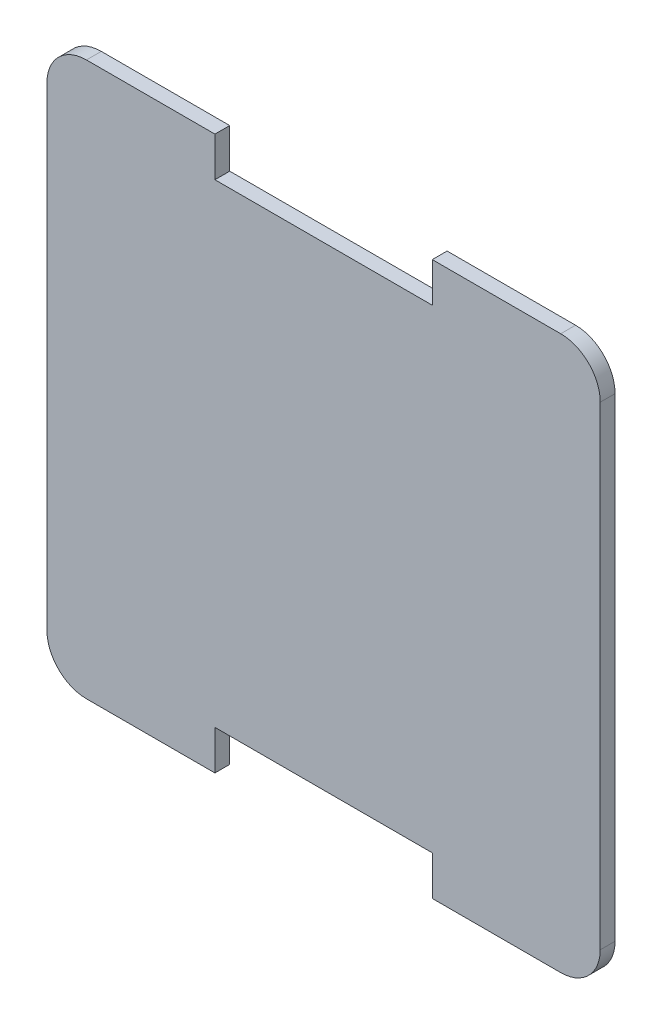
ISO-10303-21;
HEADER;
FILE_DESCRIPTION(('STEP AP214'),'2;1');
FILE_NAME('part.step','',(''),(''),'','','');
FILE_SCHEMA(('AUTOMOTIVE_DESIGN { 1 0 10303 214 1 1 1 1 }'));
ENDSEC;
DATA;
#1=APPLICATION_CONTEXT('core data for automotive mechanical design processes');
#2=APPLICATION_PROTOCOL_DEFINITION('international standard','automotive_design',2000,#1);
#3=PRODUCT_CONTEXT('',#1,'mechanical');
#4=PRODUCT('Part','Part','',(#3));
#5=PRODUCT_RELATED_PRODUCT_CATEGORY('part','',(#4));
#6=PRODUCT_DEFINITION_FORMATION('','',#4);
#7=PRODUCT_DEFINITION_CONTEXT('part definition',#1,'design');
#8=PRODUCT_DEFINITION('design','',#6,#7);
#9=PRODUCT_DEFINITION_SHAPE('','',#8);
#10=(LENGTH_UNIT() NAMED_UNIT(*) SI_UNIT(.MILLI.,.METRE.));
#11=(NAMED_UNIT(*) PLANE_ANGLE_UNIT() SI_UNIT($,.RADIAN.));
#12=(NAMED_UNIT(*) SI_UNIT($,.STERADIAN.) SOLID_ANGLE_UNIT());
#13=UNCERTAINTY_MEASURE_WITH_UNIT(LENGTH_MEASURE(1.E-05),#10,'distance_accuracy_value','');
#14=(GEOMETRIC_REPRESENTATION_CONTEXT(3) GLOBAL_UNCERTAINTY_ASSIGNED_CONTEXT((#13)) GLOBAL_UNIT_ASSIGNED_CONTEXT((#10,
#11,#12)) REPRESENTATION_CONTEXT('',''));
#15=CARTESIAN_POINT('',(0.,0.,0.));
#16=DIRECTION('',(0.,0.,1.));
#17=DIRECTION('',(1.,0.,0.));
#18=AXIS2_PLACEMENT_3D('',#15,#16,#17);
#19=CARTESIAN_POINT('',(25.4000000000002,0.,9.525));
#20=DIRECTION('',(0.,1.,0.));
#21=DIRECTION('',(0.,0.,1.));
#22=AXIS2_PLACEMENT_3D('',#19,#20,#21);
#23=PLANE('',#22);
#24=DIRECTION('',(1.,0.,0.));
#25=VECTOR('',#24,1.);
#26=CARTESIAN_POINT('',(25.4000000000002,0.,9.525));
#27=LINE('',#26,#25);
#28=CARTESIAN_POINT('',(247.65,0.,9.525));
#29=VERTEX_POINT('',#28);
#30=CARTESIAN_POINT('',(330.2,0.,9.525));
#31=VERTEX_POINT('',#30);
#32=EDGE_CURVE('E161',#29,#31,#27,.T.);
#33=ORIENTED_EDGE('',*,*,#32,.F.);
#34=DIRECTION('',(0.,0.,-1.));
#35=VECTOR('',#34,1.);
#36=CARTESIAN_POINT('',(247.65,0.,9.525));
#37=LINE('',#36,#35);
#38=CARTESIAN_POINT('',(247.65,0.,0.));
#39=VERTEX_POINT('',#38);
#40=EDGE_CURVE('E147',#29,#39,#37,.T.);
#41=ORIENTED_EDGE('',*,*,#40,.T.);
#42=DIRECTION('',(1.,0.,0.));
#43=VECTOR('',#42,1.);
#44=CARTESIAN_POINT('',(25.4000000000002,0.,0.));
#45=LINE('',#44,#43);
#46=CARTESIAN_POINT('',(330.2,0.,0.));
#47=VERTEX_POINT('',#46);
#48=EDGE_CURVE('E197',#39,#47,#45,.T.);
#49=ORIENTED_EDGE('',*,*,#48,.T.);
#50=DIRECTION('',(0.,0.,-1.));
#51=VECTOR('',#50,1.);
#52=CARTESIAN_POINT('',(330.2,0.,9.525));
#53=LINE('',#52,#51);
#54=EDGE_CURVE('E41',#31,#47,#53,.T.);
#55=ORIENTED_EDGE('',*,*,#54,.F.);
#56=EDGE_LOOP('',(#33,#41,#49,#55));
#57=FACE_BOUND('',#56,.T.);
#58=ADVANCED_FACE('F33',(#57),#23,.F.);
#59=CARTESIAN_POINT('',(25.4000000000002,355.6,9.525));
#60=DIRECTION('',(0.,-1.,0.));
#61=DIRECTION('',(0.,0.,-1.));
#62=AXIS2_PLACEMENT_3D('',#59,#60,#61);
#63=PLANE('',#62);
#64=DIRECTION('',(-1.,0.,0.));
#65=VECTOR('',#64,1.);
#66=CARTESIAN_POINT('',(25.4000000000002,355.6,0.));
#67=LINE('',#66,#65);
#68=CARTESIAN_POINT('',(330.2,355.6,0.));
#69=VERTEX_POINT('',#68);
#70=CARTESIAN_POINT('',(247.65,355.6,0.));
#71=VERTEX_POINT('',#70);
#72=EDGE_CURVE('E209',#69,#71,#67,.T.);
#73=ORIENTED_EDGE('',*,*,#72,.T.);
#74=DIRECTION('',(0.,0.,-1.));
#75=VECTOR('',#74,1.);
#76=CARTESIAN_POINT('',(247.65,355.6,9.525));
#77=LINE('',#76,#75);
#78=CARTESIAN_POINT('',(247.65,355.6,9.525));
#79=VERTEX_POINT('',#78);
#80=EDGE_CURVE('E198',#79,#71,#77,.T.);
#81=ORIENTED_EDGE('',*,*,#80,.F.);
#82=DIRECTION('',(-1.,0.,0.));
#83=VECTOR('',#82,1.);
#84=CARTESIAN_POINT('',(25.4000000000002,355.6,9.525));
#85=LINE('',#84,#83);
#86=CARTESIAN_POINT('',(330.2,355.6,9.525));
#87=VERTEX_POINT('',#86);
#88=EDGE_CURVE('E186',#87,#79,#85,.T.);
#89=ORIENTED_EDGE('',*,*,#88,.F.);
#90=DIRECTION('',(0.,0.,-1.));
#91=VECTOR('',#90,1.);
#92=CARTESIAN_POINT('',(330.2,355.6,9.525));
#93=LINE('',#92,#91);
#94=EDGE_CURVE('E223',#87,#69,#93,.T.);
#95=ORIENTED_EDGE('',*,*,#94,.T.);
#96=EDGE_LOOP('',(#73,#81,#89,#95));
#97=FACE_BOUND('',#96,.T.);
#98=ADVANCED_FACE('F254',(#97),#63,.F.);
#99=CARTESIAN_POINT('',(25.4,25.4,9.525));
#100=DIRECTION('',(0.,0.,-1.));
#101=DIRECTION('',(-1.,0.,0.));
#102=AXIS2_PLACEMENT_3D('',#99,#100,#101);
#103=CYLINDRICAL_SURFACE('',#102,25.4);
#104=CARTESIAN_POINT('',(25.4,25.4,0.));
#105=DIRECTION('',(0.,0.,1.));
#106=DIRECTION('',(-1.,0.,0.));
#107=AXIS2_PLACEMENT_3D('',#104,#105,#106);
#108=CIRCLE('',#107,25.4);
#109=CARTESIAN_POINT('',(0.,25.4000000000002,0.));
#110=VERTEX_POINT('',#109);
#111=CARTESIAN_POINT('',(25.4000000000002,0.,0.));
#112=VERTEX_POINT('',#111);
#113=EDGE_CURVE('E194',#110,#112,#108,.T.);
#114=ORIENTED_EDGE('',*,*,#113,.T.);
#115=DIRECTION('',(0.,0.,-1.));
#116=VECTOR('',#115,1.);
#117=CARTESIAN_POINT('',(25.4000000000002,0.,9.525));
#118=LINE('',#117,#116);
#119=CARTESIAN_POINT('',(25.4000000000002,0.,9.525));
#120=VERTEX_POINT('',#119);
#121=EDGE_CURVE('E11',#120,#112,#118,.T.);
#122=ORIENTED_EDGE('',*,*,#121,.F.);
#123=CARTESIAN_POINT('',(25.4,25.4,9.525));
#124=DIRECTION('',(0.,0.,1.));
#125=DIRECTION('',(-1.,0.,0.));
#126=AXIS2_PLACEMENT_3D('',#123,#124,#125);
#127=CIRCLE('',#126,25.4);
#128=CARTESIAN_POINT('',(0.,25.4000000000002,9.525));
#129=VERTEX_POINT('',#128);
#130=EDGE_CURVE('E171',#129,#120,#127,.T.);
#131=ORIENTED_EDGE('',*,*,#130,.F.);
#132=DIRECTION('',(0.,0.,-1.));
#133=VECTOR('',#132,1.);
#134=CARTESIAN_POINT('',(0.,25.4000000000002,9.525));
#135=LINE('',#134,#133);
#136=EDGE_CURVE('E193',#129,#110,#135,.T.);
#137=ORIENTED_EDGE('',*,*,#136,.T.);
#138=EDGE_LOOP('',(#114,#122,#131,#137));
#139=FACE_BOUND('',#138,.T.);
#140=ADVANCED_FACE('F35',(#139),#103,.T.);
#141=CARTESIAN_POINT('',(107.95,0.,0.));
#142=VERTEX_POINT('',#141);
#143=EDGE_CURVE('E199',#112,#142,#45,.T.);
#144=ORIENTED_EDGE('',*,*,#143,.T.);
#145=DIRECTION('',(0.,0.,-1.));
#146=VECTOR('',#145,1.);
#147=CARTESIAN_POINT('',(107.95,0.,9.525));
#148=LINE('',#147,#146);
#149=CARTESIAN_POINT('',(107.95,0.,9.525));
#150=VERTEX_POINT('',#149);
#151=EDGE_CURVE('E48',#150,#142,#148,.T.);
#152=ORIENTED_EDGE('',*,*,#151,.F.);
#153=EDGE_CURVE('E170',#120,#150,#27,.T.);
#154=ORIENTED_EDGE('',*,*,#153,.F.);
#155=ORIENTED_EDGE('',*,*,#121,.T.);
#156=EDGE_LOOP('',(#144,#152,#154,#155));
#157=FACE_BOUND('',#156,.T.);
#158=ADVANCED_FACE('F295',(#157),#23,.F.);
#159=CARTESIAN_POINT('',(330.2,25.4,9.525));
#160=DIRECTION('',(0.,0.,-1.));
#161=DIRECTION('',(-1.,0.,0.));
#162=AXIS2_PLACEMENT_3D('',#159,#160,#161);
#163=CYLINDRICAL_SURFACE('',#162,25.4);
#164=CARTESIAN_POINT('',(330.2,25.4,0.));
#165=DIRECTION('',(0.,0.,1.));
#166=DIRECTION('',(1.,0.,0.));
#167=AXIS2_PLACEMENT_3D('',#164,#165,#166);
#168=CIRCLE('',#167,25.4);
#169=CARTESIAN_POINT('',(355.6,25.4000000000002,0.));
#170=VERTEX_POINT('',#169);
#171=EDGE_CURVE('E202',#47,#170,#168,.T.);
#172=ORIENTED_EDGE('',*,*,#171,.T.);
#173=DIRECTION('',(0.,0.,-1.));
#174=VECTOR('',#173,1.);
#175=CARTESIAN_POINT('',(355.6,25.4000000000002,9.525));
#176=LINE('',#175,#174);
#177=CARTESIAN_POINT('',(355.6,25.4000000000002,9.525));
#178=VERTEX_POINT('',#177);
#179=EDGE_CURVE('E229',#178,#170,#176,.T.);
#180=ORIENTED_EDGE('',*,*,#179,.F.);
#181=CARTESIAN_POINT('',(330.2,25.4,9.525));
#182=DIRECTION('',(0.,0.,1.));
#183=DIRECTION('',(1.,0.,0.));
#184=AXIS2_PLACEMENT_3D('',#181,#182,#183);
#185=CIRCLE('',#184,25.4);
#186=EDGE_CURVE('E174',#31,#178,#185,.T.);
#187=ORIENTED_EDGE('',*,*,#186,.F.);
#188=ORIENTED_EDGE('',*,*,#54,.T.);
#189=EDGE_LOOP('',(#172,#180,#187,#188));
#190=FACE_BOUND('',#189,.T.);
#191=ADVANCED_FACE('F233',(#190),#163,.T.);
#192=CARTESIAN_POINT('',(355.6,25.4000000000002,9.525));
#193=DIRECTION('',(-1.,0.,0.));
#194=DIRECTION('',(0.,0.,1.));
#195=AXIS2_PLACEMENT_3D('',#192,#193,#194);
#196=PLANE('',#195);
#197=DIRECTION('',(0.,1.,0.));
#198=VECTOR('',#197,1.);
#199=CARTESIAN_POINT('',(355.6,25.4000000000002,0.));
#200=LINE('',#199,#198);
#201=CARTESIAN_POINT('',(355.6,330.2,0.));
#202=VERTEX_POINT('',#201);
#203=EDGE_CURVE('E204',#170,#202,#200,.T.);
#204=ORIENTED_EDGE('',*,*,#203,.T.);
#205=DIRECTION('',(0.,0.,-1.));
#206=VECTOR('',#205,1.);
#207=CARTESIAN_POINT('',(355.6,330.2,9.525));
#208=LINE('',#207,#206);
#209=CARTESIAN_POINT('',(355.6,330.2,9.525));
#210=VERTEX_POINT('',#209);
#211=EDGE_CURVE('E226',#210,#202,#208,.T.);
#212=ORIENTED_EDGE('',*,*,#211,.F.);
#213=DIRECTION('',(0.,1.,0.));
#214=VECTOR('',#213,1.);
#215=CARTESIAN_POINT('',(355.6,25.4000000000002,9.525));
#216=LINE('',#215,#214);
#217=EDGE_CURVE('E181',#178,#210,#216,.T.);
#218=ORIENTED_EDGE('',*,*,#217,.F.);
#219=ORIENTED_EDGE('',*,*,#179,.T.);
#220=EDGE_LOOP('',(#204,#212,#218,#219));
#221=FACE_BOUND('',#220,.T.);
#222=ADVANCED_FACE('F242',(#221),#196,.F.);
#223=CARTESIAN_POINT('',(330.2,330.2,9.525));
#224=DIRECTION('',(0.,0.,-1.));
#225=DIRECTION('',(-1.,0.,0.));
#226=AXIS2_PLACEMENT_3D('',#223,#224,#225);
#227=CYLINDRICAL_SURFACE('',#226,25.4);
#228=CARTESIAN_POINT('',(330.2,330.2,0.));
#229=DIRECTION('',(0.,0.,1.));
#230=DIRECTION('',(-1.,0.,0.));
#231=AXIS2_PLACEMENT_3D('',#228,#229,#230);
#232=CIRCLE('',#231,25.4);
#233=EDGE_CURVE('E206',#202,#69,#232,.T.);
#234=ORIENTED_EDGE('',*,*,#233,.T.);
#235=ORIENTED_EDGE('',*,*,#94,.F.);
#236=CARTESIAN_POINT('',(330.2,330.2,9.525));
#237=DIRECTION('',(0.,0.,1.));
#238=DIRECTION('',(-1.,0.,0.));
#239=AXIS2_PLACEMENT_3D('',#236,#237,#238);
#240=CIRCLE('',#239,25.4);
#241=EDGE_CURVE('E183',#210,#87,#240,.T.);
#242=ORIENTED_EDGE('',*,*,#241,.F.);
#243=ORIENTED_EDGE('',*,*,#211,.T.);
#244=EDGE_LOOP('',(#234,#235,#242,#243));
#245=FACE_BOUND('',#244,.T.);
#246=ADVANCED_FACE('F246',(#245),#227,.T.);
#247=CARTESIAN_POINT('',(107.95,355.6,9.525));
#248=VERTEX_POINT('',#247);
#249=CARTESIAN_POINT('',(25.4000000000002,355.6,9.525));
#250=VERTEX_POINT('',#249);
#251=EDGE_CURVE('E185',#248,#250,#85,.T.);
#252=ORIENTED_EDGE('',*,*,#251,.F.);
#253=DIRECTION('',(0.,0.,-1.));
#254=VECTOR('',#253,1.);
#255=CARTESIAN_POINT('',(107.95,355.6,9.525));
#256=LINE('',#255,#254);
#257=CARTESIAN_POINT('',(107.95,355.6,0.));
#258=VERTEX_POINT('',#257);
#259=EDGE_CURVE('E255',#248,#258,#256,.T.);
#260=ORIENTED_EDGE('',*,*,#259,.T.);
#261=CARTESIAN_POINT('',(25.4000000000002,355.6,0.));
#262=VERTEX_POINT('',#261);
#263=EDGE_CURVE('E208',#258,#262,#67,.T.);
#264=ORIENTED_EDGE('',*,*,#263,.T.);
#265=DIRECTION('',(0.,0.,-1.));
#266=VECTOR('',#265,1.);
#267=CARTESIAN_POINT('',(25.4000000000002,355.6,9.525));
#268=LINE('',#267,#266);
#269=EDGE_CURVE('E220',#250,#262,#268,.T.);
#270=ORIENTED_EDGE('',*,*,#269,.F.);
#271=EDGE_LOOP('',(#252,#260,#264,#270));
#272=FACE_BOUND('',#271,.T.);
#273=ADVANCED_FACE('F317',(#272),#63,.F.);
#274=CARTESIAN_POINT('',(25.4,330.2,9.525));
#275=DIRECTION('',(0.,0.,-1.));
#276=DIRECTION('',(-1.,0.,0.));
#277=AXIS2_PLACEMENT_3D('',#274,#275,#276);
#278=CYLINDRICAL_SURFACE('',#277,25.4);
#279=CARTESIAN_POINT('',(25.4,330.2,0.));
#280=DIRECTION('',(0.,0.,1.));
#281=DIRECTION('',(-1.,0.,0.));
#282=AXIS2_PLACEMENT_3D('',#279,#280,#281);
#283=CIRCLE('',#282,25.4);
#284=CARTESIAN_POINT('',(0.,330.2,0.));
#285=VERTEX_POINT('',#284);
#286=EDGE_CURVE('E212',#262,#285,#283,.T.);
#287=ORIENTED_EDGE('',*,*,#286,.T.);
#288=DIRECTION('',(0.,0.,-1.));
#289=VECTOR('',#288,1.);
#290=CARTESIAN_POINT('',(0.,330.2,9.525));
#291=LINE('',#290,#289);
#292=CARTESIAN_POINT('',(0.,330.2,9.525));
#293=VERTEX_POINT('',#292);
#294=EDGE_CURVE('E217',#293,#285,#291,.T.);
#295=ORIENTED_EDGE('',*,*,#294,.F.);
#296=CARTESIAN_POINT('',(25.4,330.2,9.525));
#297=DIRECTION('',(0.,0.,1.));
#298=DIRECTION('',(-1.,0.,0.));
#299=AXIS2_PLACEMENT_3D('',#296,#297,#298);
#300=CIRCLE('',#299,25.4);
#301=EDGE_CURVE('E189',#250,#293,#300,.T.);
#302=ORIENTED_EDGE('',*,*,#301,.F.);
#303=ORIENTED_EDGE('',*,*,#269,.T.);
#304=EDGE_LOOP('',(#287,#295,#302,#303));
#305=FACE_BOUND('',#304,.T.);
#306=ADVANCED_FACE('F337',(#305),#278,.T.);
#307=CARTESIAN_POINT('',(0.,25.4000000000002,9.525));
#308=DIRECTION('',(1.,0.,0.));
#309=DIRECTION('',(0.,0.,-1.));
#310=AXIS2_PLACEMENT_3D('',#307,#308,#309);
#311=PLANE('',#310);
#312=DIRECTION('',(0.,-1.,0.));
#313=VECTOR('',#312,1.);
#314=CARTESIAN_POINT('',(0.,25.4000000000002,0.));
#315=LINE('',#314,#313);
#316=EDGE_CURVE('E176',#285,#110,#315,.T.);
#317=ORIENTED_EDGE('',*,*,#316,.T.);
#318=ORIENTED_EDGE('',*,*,#136,.F.);
#319=DIRECTION('',(0.,-1.,0.));
#320=VECTOR('',#319,1.);
#321=CARTESIAN_POINT('',(0.,25.4000000000002,9.525));
#322=LINE('',#321,#320);
#323=EDGE_CURVE('E191',#293,#129,#322,.T.);
#324=ORIENTED_EDGE('',*,*,#323,.F.);
#325=ORIENTED_EDGE('',*,*,#294,.T.);
#326=EDGE_LOOP('',(#317,#318,#324,#325));
#327=FACE_BOUND('',#326,.T.);
#328=ADVANCED_FACE('F332',(#327),#311,.F.);
#329=CARTESIAN_POINT('',(25.4,25.4,9.525));
#330=DIRECTION('',(0.,0.,-1.));
#331=DIRECTION('',(-1.,0.,0.));
#332=AXIS2_PLACEMENT_3D('',#329,#330,#331);
#333=PLANE('',#332);
#334=DIRECTION('',(1.,0.,0.));
#335=VECTOR('',#334,1.);
#336=CARTESIAN_POINT('',(247.65,25.4,9.525));
#337=LINE('',#336,#335);
#338=CARTESIAN_POINT('',(107.95,25.4,9.525));
#339=VERTEX_POINT('',#338);
#340=CARTESIAN_POINT('',(247.65,25.4,9.525));
#341=VERTEX_POINT('',#340);
#342=EDGE_CURVE('E157',#339,#341,#337,.T.);
#343=ORIENTED_EDGE('',*,*,#342,.T.);
#344=DIRECTION('',(0.,-1.,0.));
#345=VECTOR('',#344,1.);
#346=CARTESIAN_POINT('',(247.65,25.4,9.525));
#347=LINE('',#346,#345);
#348=EDGE_CURVE('E150',#341,#29,#347,.T.);
#349=ORIENTED_EDGE('',*,*,#348,.T.);
#350=ORIENTED_EDGE('',*,*,#32,.T.);
#351=ORIENTED_EDGE('',*,*,#186,.T.);
#352=ORIENTED_EDGE('',*,*,#217,.T.);
#353=ORIENTED_EDGE('',*,*,#241,.T.);
#354=ORIENTED_EDGE('',*,*,#88,.T.);
#355=DIRECTION('',(0.,-1.,0.));
#356=VECTOR('',#355,1.);
#357=CARTESIAN_POINT('',(247.65,355.6,9.525));
#358=LINE('',#357,#356);
#359=CARTESIAN_POINT('',(247.65,330.2,9.525));
#360=VERTEX_POINT('',#359);
#361=EDGE_CURVE('E251',#79,#360,#358,.T.);
#362=ORIENTED_EDGE('',*,*,#361,.T.);
#363=DIRECTION('',(-1.,0.,0.));
#364=VECTOR('',#363,1.);
#365=CARTESIAN_POINT('',(247.65,330.2,9.525));
#366=LINE('',#365,#364);
#367=CARTESIAN_POINT('',(107.95,330.2,9.525));
#368=VERTEX_POINT('',#367);
#369=EDGE_CURVE('E271',#360,#368,#366,.T.);
#370=ORIENTED_EDGE('',*,*,#369,.T.);
#371=DIRECTION('',(0.,1.,0.));
#372=VECTOR('',#371,1.);
#373=CARTESIAN_POINT('',(107.95,355.6,9.525));
#374=LINE('',#373,#372);
#375=EDGE_CURVE('E265',#368,#248,#374,.T.);
#376=ORIENTED_EDGE('',*,*,#375,.T.);
#377=ORIENTED_EDGE('',*,*,#251,.T.);
#378=ORIENTED_EDGE('',*,*,#301,.T.);
#379=ORIENTED_EDGE('',*,*,#323,.T.);
#380=ORIENTED_EDGE('',*,*,#130,.T.);
#381=ORIENTED_EDGE('',*,*,#153,.T.);
#382=DIRECTION('',(0.,1.,0.));
#383=VECTOR('',#382,1.);
#384=CARTESIAN_POINT('',(107.95,25.4,9.525));
#385=LINE('',#384,#383);
#386=EDGE_CURVE('E165',#150,#339,#385,.T.);
#387=ORIENTED_EDGE('',*,*,#386,.T.);
#388=EDGE_LOOP('',(#343,#349,#350,#351,#352,#353,#354,#362,#370,#376,#377,#378,#379,#380,#381,#387));
#389=FACE_BOUND('',#388,.T.);
#390=ADVANCED_FACE('F160',(#389),#333,.F.);
#391=CARTESIAN_POINT('',(25.4,25.4,0.));
#392=DIRECTION('',(0.,0.,-1.));
#393=DIRECTION('',(-1.,0.,0.));
#394=AXIS2_PLACEMENT_3D('',#391,#392,#393);
#395=PLANE('',#394);
#396=DIRECTION('',(0.,-1.,0.));
#397=VECTOR('',#396,1.);
#398=CARTESIAN_POINT('',(247.65,25.4,0.));
#399=LINE('',#398,#397);
#400=CARTESIAN_POINT('',(247.65,25.4,0.));
#401=VERTEX_POINT('',#400);
#402=EDGE_CURVE('E153',#401,#39,#399,.T.);
#403=ORIENTED_EDGE('',*,*,#402,.F.);
#404=DIRECTION('',(1.,0.,0.));
#405=VECTOR('',#404,1.);
#406=CARTESIAN_POINT('',(247.65,25.4,0.));
#407=LINE('',#406,#405);
#408=CARTESIAN_POINT('',(107.95,25.4,0.));
#409=VERTEX_POINT('',#408);
#410=EDGE_CURVE('E166',#409,#401,#407,.T.);
#411=ORIENTED_EDGE('',*,*,#410,.F.);
#412=DIRECTION('',(0.,1.,0.));
#413=VECTOR('',#412,1.);
#414=CARTESIAN_POINT('',(107.95,25.4,0.));
#415=LINE('',#414,#413);
#416=EDGE_CURVE('E289',#142,#409,#415,.T.);
#417=ORIENTED_EDGE('',*,*,#416,.F.);
#418=ORIENTED_EDGE('',*,*,#143,.F.);
#419=ORIENTED_EDGE('',*,*,#113,.F.);
#420=ORIENTED_EDGE('',*,*,#316,.F.);
#421=ORIENTED_EDGE('',*,*,#286,.F.);
#422=ORIENTED_EDGE('',*,*,#263,.F.);
#423=DIRECTION('',(0.,1.,0.));
#424=VECTOR('',#423,1.);
#425=CARTESIAN_POINT('',(107.95,355.6,0.));
#426=LINE('',#425,#424);
#427=CARTESIAN_POINT('',(107.95,330.2,0.));
#428=VERTEX_POINT('',#427);
#429=EDGE_CURVE('E261',#428,#258,#426,.T.);
#430=ORIENTED_EDGE('',*,*,#429,.F.);
#431=DIRECTION('',(-1.,0.,0.));
#432=VECTOR('',#431,1.);
#433=CARTESIAN_POINT('',(247.65,330.2,0.));
#434=LINE('',#433,#432);
#435=CARTESIAN_POINT('',(247.65,330.2,0.));
#436=VERTEX_POINT('',#435);
#437=EDGE_CURVE('E278',#436,#428,#434,.T.);
#438=ORIENTED_EDGE('',*,*,#437,.F.);
#439=DIRECTION('',(0.,-1.,0.));
#440=VECTOR('',#439,1.);
#441=CARTESIAN_POINT('',(247.65,355.6,0.));
#442=LINE('',#441,#440);
#443=EDGE_CURVE('E56',#71,#436,#442,.T.);
#444=ORIENTED_EDGE('',*,*,#443,.F.);
#445=ORIENTED_EDGE('',*,*,#72,.F.);
#446=ORIENTED_EDGE('',*,*,#233,.F.);
#447=ORIENTED_EDGE('',*,*,#203,.F.);
#448=ORIENTED_EDGE('',*,*,#171,.F.);
#449=ORIENTED_EDGE('',*,*,#48,.F.);
#450=EDGE_LOOP('',(#403,#411,#417,#418,#419,#420,#421,#422,#430,#438,#444,#445,#446,#447,#448,#449));
#451=FACE_BOUND('',#450,.T.);
#452=ADVANCED_FACE('F237',(#451),#395,.T.);
#453=CARTESIAN_POINT('',(247.65,355.6,9.525));
#454=DIRECTION('',(1.,0.,0.));
#455=DIRECTION('',(0.,0.,-1.));
#456=AXIS2_PLACEMENT_3D('',#453,#454,#455);
#457=PLANE('',#456);
#458=ORIENTED_EDGE('',*,*,#443,.T.);
#459=DIRECTION('',(0.,0.,-1.));
#460=VECTOR('',#459,1.);
#461=CARTESIAN_POINT('',(247.65,330.2,9.525));
#462=LINE('',#461,#460);
#463=EDGE_CURVE('E264',#360,#436,#462,.T.);
#464=ORIENTED_EDGE('',*,*,#463,.F.);
#465=ORIENTED_EDGE('',*,*,#361,.F.);
#466=ORIENTED_EDGE('',*,*,#80,.T.);
#467=EDGE_LOOP('',(#458,#464,#465,#466));
#468=FACE_BOUND('',#467,.T.);
#469=ADVANCED_FACE('F347',(#468),#457,.F.);
#470=CARTESIAN_POINT('',(107.95,355.6,9.525));
#471=DIRECTION('',(-1.,0.,0.));
#472=DIRECTION('',(0.,0.,1.));
#473=AXIS2_PLACEMENT_3D('',#470,#471,#472);
#474=PLANE('',#473);
#475=ORIENTED_EDGE('',*,*,#429,.T.);
#476=ORIENTED_EDGE('',*,*,#259,.F.);
#477=ORIENTED_EDGE('',*,*,#375,.F.);
#478=DIRECTION('',(0.,0.,-1.));
#479=VECTOR('',#478,1.);
#480=CARTESIAN_POINT('',(107.95,330.2,9.525));
#481=LINE('',#480,#479);
#482=EDGE_CURVE('E258',#368,#428,#481,.T.);
#483=ORIENTED_EDGE('',*,*,#482,.T.);
#484=EDGE_LOOP('',(#475,#476,#477,#483));
#485=FACE_BOUND('',#484,.T.);
#486=ADVANCED_FACE('F341',(#485),#474,.F.);
#487=CARTESIAN_POINT('',(247.65,330.2,9.525));
#488=DIRECTION('',(0.,-1.,0.));
#489=DIRECTION('',(0.,0.,-1.));
#490=AXIS2_PLACEMENT_3D('',#487,#488,#489);
#491=PLANE('',#490);
#492=ORIENTED_EDGE('',*,*,#437,.T.);
#493=ORIENTED_EDGE('',*,*,#482,.F.);
#494=ORIENTED_EDGE('',*,*,#369,.F.);
#495=ORIENTED_EDGE('',*,*,#463,.T.);
#496=EDGE_LOOP('',(#492,#493,#494,#495));
#497=FACE_BOUND('',#496,.T.);
#498=ADVANCED_FACE('F309',(#497),#491,.F.);
#499=CARTESIAN_POINT('',(247.65,25.4,9.525));
#500=DIRECTION('',(1.,0.,0.));
#501=DIRECTION('',(0.,0.,-1.));
#502=AXIS2_PLACEMENT_3D('',#499,#500,#501);
#503=PLANE('',#502);
#504=ORIENTED_EDGE('',*,*,#402,.T.);
#505=ORIENTED_EDGE('',*,*,#40,.F.);
#506=ORIENTED_EDGE('',*,*,#348,.F.);
#507=DIRECTION('',(0.,0.,-1.));
#508=VECTOR('',#507,1.);
#509=CARTESIAN_POINT('',(247.65,25.4,9.525));
#510=LINE('',#509,#508);
#511=EDGE_CURVE('E279',#341,#401,#510,.T.);
#512=ORIENTED_EDGE('',*,*,#511,.T.);
#513=EDGE_LOOP('',(#504,#505,#506,#512));
#514=FACE_BOUND('',#513,.T.);
#515=ADVANCED_FACE('F149',(#514),#503,.F.);
#516=CARTESIAN_POINT('',(247.65,25.4,9.525));
#517=DIRECTION('',(0.,1.,0.));
#518=DIRECTION('',(0.,0.,1.));
#519=AXIS2_PLACEMENT_3D('',#516,#517,#518);
#520=PLANE('',#519);
#521=ORIENTED_EDGE('',*,*,#410,.T.);
#522=ORIENTED_EDGE('',*,*,#511,.F.);
#523=ORIENTED_EDGE('',*,*,#342,.F.);
#524=DIRECTION('',(0.,0.,-1.));
#525=VECTOR('',#524,1.);
#526=CARTESIAN_POINT('',(107.95,25.4,9.525));
#527=LINE('',#526,#525);
#528=EDGE_CURVE('E284',#339,#409,#527,.T.);
#529=ORIENTED_EDGE('',*,*,#528,.T.);
#530=EDGE_LOOP('',(#521,#522,#523,#529));
#531=FACE_BOUND('',#530,.T.);
#532=ADVANCED_FACE('F301',(#531),#520,.F.);
#533=CARTESIAN_POINT('',(107.95,25.4,9.525));
#534=DIRECTION('',(-1.,0.,0.));
#535=DIRECTION('',(0.,0.,1.));
#536=AXIS2_PLACEMENT_3D('',#533,#534,#535);
#537=PLANE('',#536);
#538=ORIENTED_EDGE('',*,*,#416,.T.);
#539=ORIENTED_EDGE('',*,*,#528,.F.);
#540=ORIENTED_EDGE('',*,*,#386,.F.);
#541=ORIENTED_EDGE('',*,*,#151,.T.);
#542=EDGE_LOOP('',(#538,#539,#540,#541));
#543=FACE_BOUND('',#542,.T.);
#544=ADVANCED_FACE('F293',(#543),#537,.F.);
#545=CLOSED_SHELL('',(#58,#98,#140,#158,#191,#222,#246,#273,#306,#328,#390,#452,#469,#486,#498,
#515,#532,#544));
#546=MANIFOLD_SOLID_BREP('B2',#545);
#547=ADVANCED_BREP_SHAPE_REPRESENTATION('',(#18,#546),#14);
#548=SHAPE_DEFINITION_REPRESENTATION(#9,#547);
ENDSEC;
END-ISO-10303-21;
